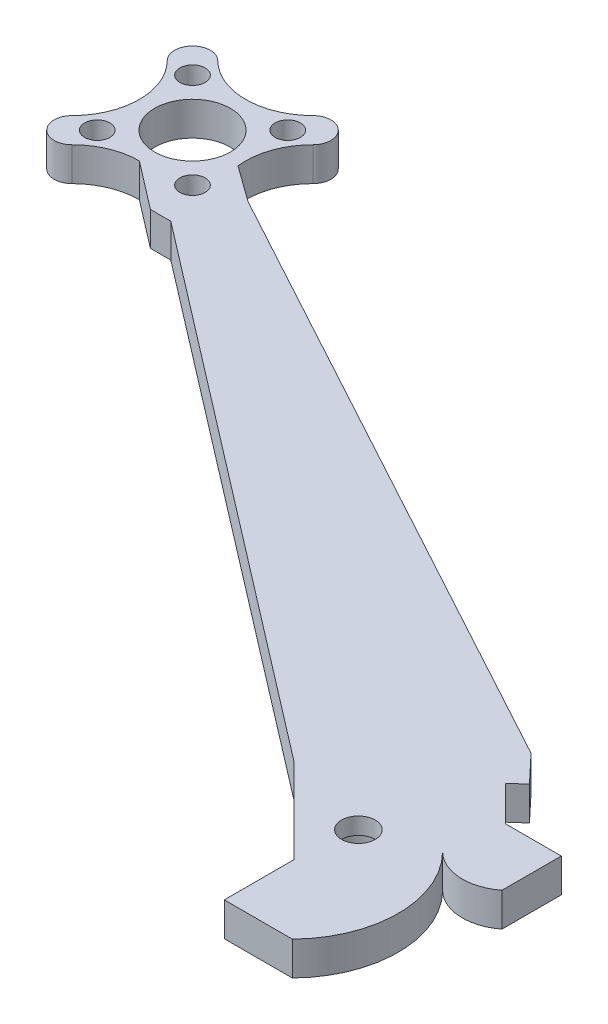
ISO-10303-21;
HEADER;
FILE_DESCRIPTION(('STEP AP214'),'2;1');
FILE_NAME('part.step','',(''),(''),'','','');
FILE_SCHEMA(('AUTOMOTIVE_DESIGN { 1 0 10303 214 1 1 1 1 }'));
ENDSEC;
DATA;
#1=APPLICATION_CONTEXT('core data for automotive mechanical design processes');
#2=APPLICATION_PROTOCOL_DEFINITION('international standard','automotive_design',2000,#1);
#3=PRODUCT_CONTEXT('',#1,'mechanical');
#4=PRODUCT('Part','Part','',(#3));
#5=PRODUCT_RELATED_PRODUCT_CATEGORY('part','',(#4));
#6=PRODUCT_DEFINITION_FORMATION('','',#4);
#7=PRODUCT_DEFINITION_CONTEXT('part definition',#1,'design');
#8=PRODUCT_DEFINITION('design','',#6,#7);
#9=PRODUCT_DEFINITION_SHAPE('','',#8);
#10=(LENGTH_UNIT() NAMED_UNIT(*) SI_UNIT(.MILLI.,.METRE.));
#11=(NAMED_UNIT(*) PLANE_ANGLE_UNIT() SI_UNIT($,.RADIAN.));
#12=(NAMED_UNIT(*) SI_UNIT($,.STERADIAN.) SOLID_ANGLE_UNIT());
#13=UNCERTAINTY_MEASURE_WITH_UNIT(LENGTH_MEASURE(1.E-05),#10,'distance_accuracy_value','');
#14=(GEOMETRIC_REPRESENTATION_CONTEXT(3) GLOBAL_UNCERTAINTY_ASSIGNED_CONTEXT((#13)) GLOBAL_UNIT_ASSIGNED_CONTEXT((#10,
#11,#12)) REPRESENTATION_CONTEXT('',''));
#15=CARTESIAN_POINT('',(0.,0.,0.));
#16=DIRECTION('',(0.,0.,1.));
#17=DIRECTION('',(1.,0.,0.));
#18=AXIS2_PLACEMENT_3D('',#15,#16,#17);
#19=CARTESIAN_POINT('',(81.80780567727,10.,62.1037977929157));
#20=DIRECTION('',(0.,-1.,0.));
#21=DIRECTION('',(0.,0.,-1.));
#22=AXIS2_PLACEMENT_3D('',#19,#20,#21);
#23=CYLINDRICAL_SURFACE('',#22,1.99999999999999);
#24=CARTESIAN_POINT('',(81.80780567727,4.,62.1037977929157));
#25=DIRECTION('',(0.,1.,0.));
#26=DIRECTION('',(0.,0.,1.));
#27=AXIS2_PLACEMENT_3D('',#24,#25,#26);
#28=CIRCLE('',#27,1.99999999999999);
#29=CARTESIAN_POINT('',(81.80780567727,4.,64.1037977929157));
#30=VERTEX_POINT('',#29);
#31=EDGE_CURVE('E223',#30,#30,#28,.T.);
#32=ORIENTED_EDGE('',*,*,#31,.T.);
#33=EDGE_LOOP('',(#32));
#34=FACE_BOUND('',#33,.T.);
#35=CARTESIAN_POINT('',(81.80780567727,2.,62.1037977929157));
#36=DIRECTION('',(0.,-1.,0.));
#37=DIRECTION('',(0.,0.,-1.));
#38=AXIS2_PLACEMENT_3D('',#35,#36,#37);
#39=CIRCLE('',#38,1.99999999999999);
#40=CARTESIAN_POINT('',(81.80780567727,2.,60.1037977929157));
#41=VERTEX_POINT('',#40);
#42=EDGE_CURVE('E51',#41,#41,#39,.F.);
#43=ORIENTED_EDGE('',*,*,#42,.F.);
#44=EDGE_LOOP('',(#43));
#45=FACE_BOUND('',#44,.T.);
#46=ADVANCED_FACE('F50',(#34,#45),#23,.F.);
#47=CARTESIAN_POINT('',(0.,4.,0.));
#48=DIRECTION('',(0.,1.,0.));
#49=DIRECTION('',(0.,0.,1.));
#50=AXIS2_PLACEMENT_3D('',#47,#48,#49);
#51=PLANE('',#50);
#52=ORIENTED_EDGE('',*,*,#31,.F.);
#53=EDGE_LOOP('',(#52));
#54=FACE_BOUND('',#53,.T.);
#55=CARTESIAN_POINT('',(-5.65685424949232,4.,-5.65685424949244));
#56=DIRECTION('',(0.,1.,0.));
#57=DIRECTION('',(0.,0.,1.));
#58=AXIS2_PLACEMENT_3D('',#55,#56,#57);
#59=CIRCLE('',#58,1.5);
#60=CARTESIAN_POINT('',(-5.65685424949232,4.,-4.15685424949244));
#61=VERTEX_POINT('',#60);
#62=EDGE_CURVE('E443',#61,#61,#59,.T.);
#63=ORIENTED_EDGE('',*,*,#62,.F.);
#64=EDGE_LOOP('',(#63));
#65=FACE_BOUND('',#64,.T.);
#66=CARTESIAN_POINT('',(-5.65685424949242,4.,5.65685424949234));
#67=DIRECTION('',(0.,1.,0.));
#68=DIRECTION('',(0.,0.,1.));
#69=AXIS2_PLACEMENT_3D('',#66,#67,#68);
#70=CIRCLE('',#69,1.5);
#71=CARTESIAN_POINT('',(-5.65685424949242,4.,7.15685424949234));
#72=VERTEX_POINT('',#71);
#73=EDGE_CURVE('E436',#72,#72,#70,.T.);
#74=ORIENTED_EDGE('',*,*,#73,.F.);
#75=EDGE_LOOP('',(#74));
#76=FACE_BOUND('',#75,.T.);
#77=CARTESIAN_POINT('',(5.65685424949238,4.,-5.65685424949238));
#78=DIRECTION('',(0.,1.,0.));
#79=DIRECTION('',(0.,0.,1.));
#80=AXIS2_PLACEMENT_3D('',#77,#78,#79);
#81=CIRCLE('',#80,1.5);
#82=CARTESIAN_POINT('',(5.65685424949238,4.,-4.15685424949238));
#83=VERTEX_POINT('',#82);
#84=EDGE_CURVE('E431',#83,#83,#81,.T.);
#85=ORIENTED_EDGE('',*,*,#84,.F.);
#86=EDGE_LOOP('',(#85));
#87=FACE_BOUND('',#86,.T.);
#88=CARTESIAN_POINT('',(0.,4.,0.));
#89=DIRECTION('',(0.,1.,0.));
#90=DIRECTION('',(0.,0.,1.));
#91=AXIS2_PLACEMENT_3D('',#88,#89,#90);
#92=CIRCLE('',#91,4.5);
#93=CARTESIAN_POINT('',(0.,4.,4.5));
#94=VERTEX_POINT('',#93);
#95=EDGE_CURVE('E459',#94,#94,#92,.T.);
#96=ORIENTED_EDGE('',*,*,#95,.F.);
#97=EDGE_LOOP('',(#96));
#98=FACE_BOUND('',#97,.T.);
#99=CARTESIAN_POINT('',(5.65685424949236,4.,5.6568542494924));
#100=DIRECTION('',(0.,1.,0.));
#101=DIRECTION('',(0.,0.,1.));
#102=AXIS2_PLACEMENT_3D('',#99,#100,#101);
#103=CIRCLE('',#102,1.5);
#104=CARTESIAN_POINT('',(5.65685424949236,4.,7.1568542494924));
#105=VERTEX_POINT('',#104);
#106=EDGE_CURVE('E430',#105,#105,#103,.T.);
#107=ORIENTED_EDGE('',*,*,#106,.F.);
#108=EDGE_LOOP('',(#107));
#109=FACE_BOUND('',#108,.T.);
#110=CARTESIAN_POINT('',(80.0614070112013,4.,68.3559558555536));
#111=DIRECTION('',(0.,-1.,0.));
#112=DIRECTION('',(0.,0.,-1.));
#113=AXIS2_PLACEMENT_3D('',#110,#111,#112);
#114=CIRCLE('',#113,12.7279220613578);
#115=CARTESIAN_POINT('',(89.0614070112014,4.,59.3559558555538));
#116=VERTEX_POINT('',#115);
#117=CARTESIAN_POINT('',(89.1342012001975,4.,77.2825680687124));
#118=VERTEX_POINT('',#117);
#119=EDGE_CURVE('E63',#116,#118,#114,.T.);
#120=ORIENTED_EDGE('',*,*,#119,.F.);
#121=CARTESIAN_POINT('',(93.0614070112013,4.,55.3559558555539));
#122=DIRECTION('',(0.,1.,0.));
#123=DIRECTION('',(0.,0.,1.));
#124=AXIS2_PLACEMENT_3D('',#121,#122,#123);
#125=CIRCLE('',#124,5.65685424949223);
#126=CARTESIAN_POINT('',(96.5614070112013,4.,59.8000530642115));
#127=VERTEX_POINT('',#126);
#128=EDGE_CURVE('E205',#116,#127,#125,.T.);
#129=ORIENTED_EDGE('',*,*,#128,.T.);
#130=DIRECTION('',(0.,0.,-1.));
#131=VECTOR('',#130,1.);
#132=CARTESIAN_POINT('',(96.5614070112013,4.,52.7610345676334));
#133=LINE('',#132,#131);
#134=CARTESIAN_POINT('',(96.5614070112013,4.,52.7610345676334));
#135=VERTEX_POINT('',#134);
#136=EDGE_CURVE('E331',#127,#135,#133,.T.);
#137=ORIENTED_EDGE('',*,*,#136,.T.);
#138=DIRECTION('',(1.,0.,0.));
#139=VECTOR('',#138,1.);
#140=CARTESIAN_POINT('',(90.5019503136648,4.,52.7610345676334));
#141=LINE('',#140,#139);
#142=CARTESIAN_POINT('',(89.9608894690823,4.,52.7610345676334));
#143=VERTEX_POINT('',#142);
#144=EDGE_CURVE('E358',#143,#135,#141,.T.);
#145=ORIENTED_EDGE('',*,*,#144,.F.);
#146=DIRECTION('',(0.707331619227857,0.,0.706881871630966));
#147=VECTOR('',#146,1.);
#148=CARTESIAN_POINT('',(85.7805147252344,4.,48.5833178606157));
#149=LINE('',#148,#147);
#150=CARTESIAN_POINT('',(85.7805147252344,4.,48.5833178606157));
#151=VERTEX_POINT('',#150);
#152=EDGE_CURVE('E370',#151,#143,#149,.T.);
#153=ORIENTED_EDGE('',*,*,#152,.F.);
#154=DIRECTION('',(-0.749062373849123,0.,0.66249947930811));
#155=VECTOR('',#154,1.);
#156=CARTESIAN_POINT('',(87.2786394729325,4.,47.2583189019996));
#157=LINE('',#156,#155);
#158=CARTESIAN_POINT('',(87.2786394729325,4.,47.2583189019996));
#159=VERTEX_POINT('',#158);
#160=EDGE_CURVE('E350',#159,#151,#157,.T.);
#161=ORIENTED_EDGE('',*,*,#160,.F.);
#162=DIRECTION('',(-0.685611663685296,0.,-0.727967476346767));
#163=VECTOR('',#162,1.);
#164=CARTESIAN_POINT('',(87.2786394729325,4.,47.2583189019996));
#165=LINE('',#164,#163);
#166=CARTESIAN_POINT('',(84.1934838147439,4.,43.9825680687124));
#167=VERTEX_POINT('',#166);
#168=EDGE_CURVE('E295',#159,#167,#165,.T.);
#169=ORIENTED_EDGE('',*,*,#168,.T.);
#170=DIRECTION('',(-0.878817112661968,0.,-0.477158760259604));
#171=VECTOR('',#170,1.);
#172=CARTESIAN_POINT('',(84.1934838147439,4.,43.9825680687124));
#173=LINE('',#172,#171);
#174=CARTESIAN_POINT('',(10.655,4.,4.05442913872873));
#175=VERTEX_POINT('',#174);
#176=EDGE_CURVE('E377',#167,#175,#173,.T.);
#177=ORIENTED_EDGE('',*,*,#176,.T.);
#178=DIRECTION('',(-0.811476008534574,0.,-0.584385735257797));
#179=VECTOR('',#178,1.);
#180=CARTESIAN_POINT('',(6.37280582790223,4.,0.970600210382307));
#181=LINE('',#180,#179);
#182=CARTESIAN_POINT('',(6.37280582790223,4.,0.970600210382307));
#183=VERTEX_POINT('',#182);
#184=EDGE_CURVE('E203',#175,#183,#181,.T.);
#185=ORIENTED_EDGE('',*,*,#184,.T.);
#186=CARTESIAN_POINT('',(14.3137084989848,4.,0.));
#187=DIRECTION('',(0.,-1.,0.));
#188=DIRECTION('',(0.,0.,1.));
#189=AXIS2_PLACEMENT_3D('',#186,#187,#188);
#190=CIRCLE('',#189,7.99999999999998);
#191=CARTESIAN_POINT('',(8.65685424949238,4.,-5.65685424949238));
#192=VERTEX_POINT('',#191);
#193=EDGE_CURVE('E296',#183,#192,#190,.T.);
#194=ORIENTED_EDGE('',*,*,#193,.T.);
#195=CARTESIAN_POINT('',(7.15685424949238,4.,-7.15685424949241));
#196=DIRECTION('',(0.,1.,0.));
#197=DIRECTION('',(0.,0.,-1.));
#198=AXIS2_PLACEMENT_3D('',#195,#196,#197);
#199=CIRCLE('',#198,2.12132034355966);
#200=CARTESIAN_POINT('',(5.65685424949238,4.,-8.65685424949244));
#201=VERTEX_POINT('',#200);
#202=EDGE_CURVE('E301',#192,#201,#199,.T.);
#203=ORIENTED_EDGE('',*,*,#202,.T.);
#204=CARTESIAN_POINT('',(0.,4.,-14.3137084989848));
#205=DIRECTION('',(0.,-1.,0.));
#206=DIRECTION('',(0.,0.,-1.));
#207=AXIS2_PLACEMENT_3D('',#204,#205,#206);
#208=CIRCLE('',#207,7.99999999999996);
#209=CARTESIAN_POINT('',(-5.65685424949232,4.,-8.65685424949244));
#210=VERTEX_POINT('',#209);
#211=EDGE_CURVE('E254',#201,#210,#208,.T.);
#212=ORIENTED_EDGE('',*,*,#211,.T.);
#213=CARTESIAN_POINT('',(-7.15685424949232,4.,-7.15685424949244));
#214=DIRECTION('',(0.,1.,0.));
#215=DIRECTION('',(0.,0.,-1.));
#216=AXIS2_PLACEMENT_3D('',#213,#214,#215);
#217=CIRCLE('',#216,2.12132034355964);
#218=CARTESIAN_POINT('',(-8.65685424949232,4.,-5.65685424949244));
#219=VERTEX_POINT('',#218);
#220=EDGE_CURVE('E246',#210,#219,#217,.T.);
#221=ORIENTED_EDGE('',*,*,#220,.T.);
#222=CARTESIAN_POINT('',(-14.3137084989847,4.,0.));
#223=DIRECTION('',(0.,-1.,0.));
#224=DIRECTION('',(0.,0.,-1.));
#225=AXIS2_PLACEMENT_3D('',#222,#223,#224);
#226=CIRCLE('',#225,8.00000000000002);
#227=CARTESIAN_POINT('',(-8.65685424949232,4.,5.65685424949234));
#228=VERTEX_POINT('',#227);
#229=EDGE_CURVE('E285',#219,#228,#226,.T.);
#230=ORIENTED_EDGE('',*,*,#229,.T.);
#231=CARTESIAN_POINT('',(-7.15685424949237,4.,7.15685424949234));
#232=DIRECTION('',(0.,1.,0.));
#233=DIRECTION('',(0.,0.,1.));
#234=AXIS2_PLACEMENT_3D('',#231,#232,#233);
#235=CIRCLE('',#234,2.12132034355961);
#236=CARTESIAN_POINT('',(-5.65685424949242,4.,8.65685424949234));
#237=VERTEX_POINT('',#236);
#238=EDGE_CURVE('E287',#228,#237,#235,.T.);
#239=ORIENTED_EDGE('',*,*,#238,.T.);
#240=CARTESIAN_POINT('',(0.,4.,14.3137084989848));
#241=DIRECTION('',(0.,-1.,0.));
#242=DIRECTION('',(0.,0.,-1.));
#243=AXIS2_PLACEMENT_3D('',#240,#241,#242);
#244=CIRCLE('',#243,8.00000000000003);
#245=CARTESIAN_POINT('',(0.,4.,6.31370849898472));
#246=VERTEX_POINT('',#245);
#247=EDGE_CURVE('E288',#237,#246,#244,.T.);
#248=ORIENTED_EDGE('',*,*,#247,.T.);
#249=DIRECTION('',(0.793310358918495,0.,0.608817439330222));
#250=VECTOR('',#249,1.);
#251=CARTESIAN_POINT('',(5.65685424949236,4.,10.655));
#252=LINE('',#251,#250);
#253=CARTESIAN_POINT('',(5.65685424949236,4.,10.655));
#254=VERTEX_POINT('',#253);
#255=EDGE_CURVE('E231',#246,#254,#252,.T.);
#256=ORIENTED_EDGE('',*,*,#255,.T.);
#257=DIRECTION('',(1.,0.,0.));
#258=VECTOR('',#257,1.);
#259=CARTESIAN_POINT('',(0.,4.,10.655));
#260=LINE('',#259,#258);
#261=CARTESIAN_POINT('',(8.07969409634453,4.,10.655));
#262=VERTEX_POINT('',#261);
#263=EDGE_CURVE('E414',#254,#262,#260,.T.);
#264=ORIENTED_EDGE('',*,*,#263,.T.);
#265=DIRECTION('',(0.793353340291236,0.,0.60876142900872));
#266=VECTOR('',#265,1.);
#267=CARTESIAN_POINT('',(71.0614070112013,4.,58.9825680687125));
#268=LINE('',#267,#266);
#269=CARTESIAN_POINT('',(71.0614070112013,4.,58.9825680687125));
#270=VERTEX_POINT('',#269);
#271=EDGE_CURVE('E405',#262,#270,#268,.T.);
#272=ORIENTED_EDGE('',*,*,#271,.T.);
#273=DIRECTION('',(0.707106781186547,0.,0.707106781186548));
#274=VECTOR('',#273,1.);
#275=CARTESIAN_POINT('',(71.0614070112013,4.,58.9825680687125));
#276=LINE('',#275,#274);
#277=CARTESIAN_POINT('',(81.0614070112013,4.,68.9825680687125));
#278=VERTEX_POINT('',#277);
#279=EDGE_CURVE('E403',#270,#278,#276,.T.);
#280=ORIENTED_EDGE('',*,*,#279,.T.);
#281=DIRECTION('',(0.,0.,1.));
#282=VECTOR('',#281,1.);
#283=CARTESIAN_POINT('',(81.0614070112013,4.,68.9825680687125));
#284=LINE('',#283,#282);
#285=CARTESIAN_POINT('',(81.0614070112013,4.,77.2825680687124));
#286=VERTEX_POINT('',#285);
#287=EDGE_CURVE('E390',#278,#286,#284,.T.);
#288=ORIENTED_EDGE('',*,*,#287,.T.);
#289=DIRECTION('',(1.,0.,0.));
#290=VECTOR('',#289,1.);
#291=CARTESIAN_POINT('',(81.0614070112013,4.,77.2825680687124));
#292=LINE('',#291,#290);
#293=EDGE_CURVE('E311',#286,#118,#292,.T.);
#294=ORIENTED_EDGE('',*,*,#293,.T.);
#295=EDGE_LOOP('',(#120,#129,#137,#145,#153,#161,#169,#177,#185,#194,#203,#212,#221,#230,#239,
#248,#256,#264,#272,#280,#288,#294));
#296=FACE_BOUND('',#295,.T.);
#297=ADVANCED_FACE('F481',(#54,#65,#76,#87,#98,#109,#296),#51,.T.);
#298=CARTESIAN_POINT('',(96.5614070112013,0.,52.7610345676334));
#299=DIRECTION('',(1.,0.,0.));
#300=DIRECTION('',(0.,0.,-1.));
#301=AXIS2_PLACEMENT_3D('',#298,#299,#300);
#302=PLANE('',#301);
#303=ORIENTED_EDGE('',*,*,#136,.F.);
#304=DIRECTION('',(0.,1.,0.));
#305=VECTOR('',#304,1.);
#306=CARTESIAN_POINT('',(96.5614070112013,0.,59.8000530642115));
#307=LINE('',#306,#305);
#308=CARTESIAN_POINT('',(96.5614070112013,0.,59.8000530642115));
#309=VERTEX_POINT('',#308);
#310=EDGE_CURVE('E12',#127,#309,#307,.F.);
#311=ORIENTED_EDGE('',*,*,#310,.T.);
#312=DIRECTION('',(0.,0.,-1.));
#313=VECTOR('',#312,1.);
#314=CARTESIAN_POINT('',(96.5614070112013,0.,52.7610345676334));
#315=LINE('',#314,#313);
#316=CARTESIAN_POINT('',(96.5614070112013,0.,52.7610345676334));
#317=VERTEX_POINT('',#316);
#318=EDGE_CURVE('E216',#309,#317,#315,.T.);
#319=ORIENTED_EDGE('',*,*,#318,.T.);
#320=DIRECTION('',(0.,1.,0.));
#321=VECTOR('',#320,1.);
#322=CARTESIAN_POINT('',(96.5614070112013,0.,52.7610345676334));
#323=LINE('',#322,#321);
#324=EDGE_CURVE('E345',#317,#135,#323,.T.);
#325=ORIENTED_EDGE('',*,*,#324,.T.);
#326=EDGE_LOOP('',(#303,#311,#319,#325));
#327=FACE_BOUND('',#326,.T.);
#328=ADVANCED_FACE('F544',(#327),#302,.T.);
#329=CARTESIAN_POINT('',(0.,0.,0.));
#330=DIRECTION('',(0.,1.,0.));
#331=DIRECTION('',(0.,0.,1.));
#332=AXIS2_PLACEMENT_3D('',#329,#330,#331);
#333=PLANE('',#332);
#334=CARTESIAN_POINT('',(81.80780567727,0.,62.1037977929157));
#335=DIRECTION('',(0.,-1.,0.));
#336=DIRECTION('',(0.,0.,-1.));
#337=AXIS2_PLACEMENT_3D('',#334,#335,#336);
#338=CIRCLE('',#337,3.00000000000001);
#339=CARTESIAN_POINT('',(81.80780567727,0.,59.1037977929157));
#340=VERTEX_POINT('',#339);
#341=EDGE_CURVE('E657',#340,#340,#338,.T.);
#342=ORIENTED_EDGE('',*,*,#341,.F.);
#343=EDGE_LOOP('',(#342));
#344=FACE_BOUND('',#343,.T.);
#345=CARTESIAN_POINT('',(93.0614070112013,0.,55.3559558555539));
#346=DIRECTION('',(0.,1.,0.));
#347=DIRECTION('',(0.,0.,1.));
#348=AXIS2_PLACEMENT_3D('',#345,#346,#347);
#349=CIRCLE('',#348,5.65685424949223);
#350=CARTESIAN_POINT('',(89.0614070112014,0.,59.3559558555538));
#351=VERTEX_POINT('',#350);
#352=EDGE_CURVE('E202',#351,#309,#349,.T.);
#353=ORIENTED_EDGE('',*,*,#352,.F.);
#354=CARTESIAN_POINT('',(80.0614070112013,0.,68.3559558555536));
#355=DIRECTION('',(0.,-1.,0.));
#356=DIRECTION('',(0.,0.,-1.));
#357=AXIS2_PLACEMENT_3D('',#354,#355,#356);
#358=CIRCLE('',#357,12.7279220613578);
#359=CARTESIAN_POINT('',(89.1342012001975,0.,77.2825680687124));
#360=VERTEX_POINT('',#359);
#361=EDGE_CURVE('E206',#351,#360,#358,.T.);
#362=ORIENTED_EDGE('',*,*,#361,.T.);
#363=DIRECTION('',(1.,0.,0.));
#364=VECTOR('',#363,1.);
#365=CARTESIAN_POINT('',(81.0614070112013,0.,77.2825680687124));
#366=LINE('',#365,#364);
#367=CARTESIAN_POINT('',(81.0614070112013,0.,77.2825680687124));
#368=VERTEX_POINT('',#367);
#369=EDGE_CURVE('E332',#368,#360,#366,.T.);
#370=ORIENTED_EDGE('',*,*,#369,.F.);
#371=DIRECTION('',(0.,0.,1.));
#372=VECTOR('',#371,1.);
#373=CARTESIAN_POINT('',(81.0614070112013,0.,68.9825680687125));
#374=LINE('',#373,#372);
#375=CARTESIAN_POINT('',(81.0614070112013,0.,68.9825680687125));
#376=VERTEX_POINT('',#375);
#377=EDGE_CURVE('E392',#376,#368,#374,.T.);
#378=ORIENTED_EDGE('',*,*,#377,.F.);
#379=DIRECTION('',(0.707106781186547,0.,0.707106781186548));
#380=VECTOR('',#379,1.);
#381=CARTESIAN_POINT('',(71.0614070112013,0.,58.9825680687125));
#382=LINE('',#381,#380);
#383=CARTESIAN_POINT('',(71.0614070112013,0.,58.9825680687125));
#384=VERTEX_POINT('',#383);
#385=EDGE_CURVE('E393',#384,#376,#382,.T.);
#386=ORIENTED_EDGE('',*,*,#385,.F.);
#387=DIRECTION('',(0.793353340291236,0.,0.60876142900872));
#388=VECTOR('',#387,1.);
#389=CARTESIAN_POINT('',(71.0614070112013,0.,58.9825680687125));
#390=LINE('',#389,#388);
#391=CARTESIAN_POINT('',(8.07969409634453,0.,10.655));
#392=VERTEX_POINT('',#391);
#393=EDGE_CURVE('E386',#392,#384,#390,.T.);
#394=ORIENTED_EDGE('',*,*,#393,.F.);
#395=DIRECTION('',(1.,0.,0.));
#396=VECTOR('',#395,1.);
#397=CARTESIAN_POINT('',(0.,0.,10.655));
#398=LINE('',#397,#396);
#399=CARTESIAN_POINT('',(5.65685424949236,0.,10.655));
#400=VERTEX_POINT('',#399);
#401=EDGE_CURVE('E423',#400,#392,#398,.T.);
#402=ORIENTED_EDGE('',*,*,#401,.F.);
#403=DIRECTION('',(0.793310358918495,0.,0.608817439330222));
#404=VECTOR('',#403,1.);
#405=CARTESIAN_POINT('',(5.65685424949236,0.,10.655));
#406=LINE('',#405,#404);
#407=CARTESIAN_POINT('',(0.,0.,6.31370849898472));
#408=VERTEX_POINT('',#407);
#409=EDGE_CURVE('E235',#408,#400,#406,.T.);
#410=ORIENTED_EDGE('',*,*,#409,.F.);
#411=CARTESIAN_POINT('',(0.,0.,14.3137084989848));
#412=DIRECTION('',(0.,-1.,0.));
#413=DIRECTION('',(0.,0.,-1.));
#414=AXIS2_PLACEMENT_3D('',#411,#412,#413);
#415=CIRCLE('',#414,8.00000000000003);
#416=CARTESIAN_POINT('',(-5.65685424949242,0.,8.65685424949234));
#417=VERTEX_POINT('',#416);
#418=EDGE_CURVE('E263',#417,#408,#415,.T.);
#419=ORIENTED_EDGE('',*,*,#418,.F.);
#420=CARTESIAN_POINT('',(-7.15685424949237,0.,7.15685424949234));
#421=DIRECTION('',(0.,1.,0.));
#422=DIRECTION('',(0.,0.,1.));
#423=AXIS2_PLACEMENT_3D('',#420,#421,#422);
#424=CIRCLE('',#423,2.12132034355961);
#425=CARTESIAN_POINT('',(-8.65685424949232,0.,5.65685424949234));
#426=VERTEX_POINT('',#425);
#427=EDGE_CURVE('E256',#426,#417,#424,.T.);
#428=ORIENTED_EDGE('',*,*,#427,.F.);
#429=CARTESIAN_POINT('',(-14.3137084989847,0.,0.));
#430=DIRECTION('',(0.,-1.,0.));
#431=DIRECTION('',(0.,0.,-1.));
#432=AXIS2_PLACEMENT_3D('',#429,#430,#431);
#433=CIRCLE('',#432,8.00000000000002);
#434=CARTESIAN_POINT('',(-8.65685424949232,0.,-5.65685424949244));
#435=VERTEX_POINT('',#434);
#436=EDGE_CURVE('E255',#435,#426,#433,.T.);
#437=ORIENTED_EDGE('',*,*,#436,.F.);
#438=CARTESIAN_POINT('',(-7.15685424949232,0.,-7.15685424949244));
#439=DIRECTION('',(0.,1.,0.));
#440=DIRECTION('',(0.,0.,-1.));
#441=AXIS2_PLACEMENT_3D('',#438,#439,#440);
#442=CIRCLE('',#441,2.12132034355964);
#443=CARTESIAN_POINT('',(-5.65685424949232,0.,-8.65685424949244));
#444=VERTEX_POINT('',#443);
#445=EDGE_CURVE('E248',#444,#435,#442,.T.);
#446=ORIENTED_EDGE('',*,*,#445,.F.);
#447=CARTESIAN_POINT('',(0.,0.,-14.3137084989848));
#448=DIRECTION('',(0.,-1.,0.));
#449=DIRECTION('',(0.,0.,-1.));
#450=AXIS2_PLACEMENT_3D('',#447,#448,#449);
#451=CIRCLE('',#450,7.99999999999996);
#452=CARTESIAN_POINT('',(5.65685424949238,0.,-8.65685424949244));
#453=VERTEX_POINT('',#452);
#454=EDGE_CURVE('E274',#453,#444,#451,.T.);
#455=ORIENTED_EDGE('',*,*,#454,.F.);
#456=CARTESIAN_POINT('',(7.15685424949238,0.,-7.15685424949241));
#457=DIRECTION('',(0.,1.,0.));
#458=DIRECTION('',(0.,0.,-1.));
#459=AXIS2_PLACEMENT_3D('',#456,#457,#458);
#460=CIRCLE('',#459,2.12132034355966);
#461=CARTESIAN_POINT('',(8.65685424949238,0.,-5.65685424949238));
#462=VERTEX_POINT('',#461);
#463=EDGE_CURVE('E268',#462,#453,#460,.T.);
#464=ORIENTED_EDGE('',*,*,#463,.F.);
#465=CARTESIAN_POINT('',(14.3137084989848,0.,0.));
#466=DIRECTION('',(0.,-1.,0.));
#467=DIRECTION('',(0.,0.,1.));
#468=AXIS2_PLACEMENT_3D('',#465,#466,#467);
#469=CIRCLE('',#468,7.99999999999998);
#470=CARTESIAN_POINT('',(6.37280582790223,0.,0.970600210382307));
#471=VERTEX_POINT('',#470);
#472=EDGE_CURVE('E269',#471,#462,#469,.T.);
#473=ORIENTED_EDGE('',*,*,#472,.F.);
#474=DIRECTION('',(-0.811476008534574,0.,-0.584385735257797));
#475=VECTOR('',#474,1.);
#476=CARTESIAN_POINT('',(6.37280582790223,0.,0.970600210382307));
#477=LINE('',#476,#475);
#478=CARTESIAN_POINT('',(10.655,0.,4.05442913872873));
#479=VERTEX_POINT('',#478);
#480=EDGE_CURVE('E226',#479,#471,#477,.T.);
#481=ORIENTED_EDGE('',*,*,#480,.F.);
#482=DIRECTION('',(-0.878817112661968,0.,-0.477158760259604));
#483=VECTOR('',#482,1.);
#484=CARTESIAN_POINT('',(84.1934838147439,0.,43.9825680687124));
#485=LINE('',#484,#483);
#486=CARTESIAN_POINT('',(84.1934838147439,0.,43.9825680687124));
#487=VERTEX_POINT('',#486);
#488=EDGE_CURVE('E381',#487,#479,#485,.T.);
#489=ORIENTED_EDGE('',*,*,#488,.F.);
#490=DIRECTION('',(-0.685611663685296,0.,-0.727967476346767));
#491=VECTOR('',#490,1.);
#492=CARTESIAN_POINT('',(87.2786394729325,0.,47.2583189019996));
#493=LINE('',#492,#491);
#494=CARTESIAN_POINT('',(87.2786394729325,0.,47.2583189019996));
#495=VERTEX_POINT('',#494);
#496=EDGE_CURVE('E264',#495,#487,#493,.T.);
#497=ORIENTED_EDGE('',*,*,#496,.F.);
#498=DIRECTION('',(-0.749062373849123,0.,0.66249947930811));
#499=VECTOR('',#498,1.);
#500=CARTESIAN_POINT('',(87.2786394729325,0.,47.2583189019996));
#501=LINE('',#500,#499);
#502=CARTESIAN_POINT('',(85.7805147252344,0.,48.5833178606157));
#503=VERTEX_POINT('',#502);
#504=EDGE_CURVE('E352',#495,#503,#501,.T.);
#505=ORIENTED_EDGE('',*,*,#504,.T.);
#506=DIRECTION('',(0.707331619227857,0.,0.706881871630966));
#507=VECTOR('',#506,1.);
#508=CARTESIAN_POINT('',(85.7805147252344,0.,48.5833178606157));
#509=LINE('',#508,#507);
#510=CARTESIAN_POINT('',(89.9608894690823,0.,52.7610345676334));
#511=VERTEX_POINT('',#510);
#512=EDGE_CURVE('E353',#503,#511,#509,.T.);
#513=ORIENTED_EDGE('',*,*,#512,.T.);
#514=DIRECTION('',(1.,0.,0.));
#515=VECTOR('',#514,1.);
#516=CARTESIAN_POINT('',(89.9608894690823,0.,52.7610345676334));
#517=LINE('',#516,#515);
#518=EDGE_CURVE('E359',#511,#317,#517,.T.);
#519=ORIENTED_EDGE('',*,*,#518,.T.);
#520=ORIENTED_EDGE('',*,*,#318,.F.);
#521=EDGE_LOOP('',(#353,#362,#370,#378,#386,#394,#402,#410,#419,#428,#437,#446,#455,#464,#473,
#481,#489,#497,#505,#513,#519,#520));
#522=FACE_BOUND('',#521,.T.);
#523=CARTESIAN_POINT('',(-5.65685424949232,0.,-5.65685424949244));
#524=DIRECTION('',(0.,1.,0.));
#525=DIRECTION('',(0.,0.,1.));
#526=AXIS2_PLACEMENT_3D('',#523,#524,#525);
#527=CIRCLE('',#526,1.5);
#528=CARTESIAN_POINT('',(-5.65685424949232,0.,-4.15685424949244));
#529=VERTEX_POINT('',#528);
#530=EDGE_CURVE('E425',#529,#529,#527,.T.);
#531=ORIENTED_EDGE('',*,*,#530,.T.);
#532=EDGE_LOOP('',(#531));
#533=FACE_BOUND('',#532,.T.);
#534=CARTESIAN_POINT('',(-5.65685424949242,0.,5.65685424949234));
#535=DIRECTION('',(0.,1.,0.));
#536=DIRECTION('',(0.,0.,1.));
#537=AXIS2_PLACEMENT_3D('',#534,#535,#536);
#538=CIRCLE('',#537,1.5);
#539=CARTESIAN_POINT('',(-5.65685424949242,0.,7.15685424949234));
#540=VERTEX_POINT('',#539);
#541=EDGE_CURVE('E439',#540,#540,#538,.T.);
#542=ORIENTED_EDGE('',*,*,#541,.T.);
#543=EDGE_LOOP('',(#542));
#544=FACE_BOUND('',#543,.T.);
#545=CARTESIAN_POINT('',(5.65685424949238,0.,-5.65685424949238));
#546=DIRECTION('',(0.,1.,0.));
#547=DIRECTION('',(0.,0.,1.));
#548=AXIS2_PLACEMENT_3D('',#545,#546,#547);
#549=CIRCLE('',#548,1.5);
#550=CARTESIAN_POINT('',(5.65685424949238,0.,-4.15685424949238));
#551=VERTEX_POINT('',#550);
#552=EDGE_CURVE('E454',#551,#551,#549,.T.);
#553=ORIENTED_EDGE('',*,*,#552,.T.);
#554=EDGE_LOOP('',(#553));
#555=FACE_BOUND('',#554,.T.);
#556=CARTESIAN_POINT('',(0.,0.,0.));
#557=DIRECTION('',(0.,1.,0.));
#558=DIRECTION('',(0.,0.,1.));
#559=AXIS2_PLACEMENT_3D('',#556,#557,#558);
#560=CIRCLE('',#559,4.5);
#561=CARTESIAN_POINT('',(0.,0.,4.5));
#562=VERTEX_POINT('',#561);
#563=EDGE_CURVE('E452',#562,#562,#560,.T.);
#564=ORIENTED_EDGE('',*,*,#563,.T.);
#565=EDGE_LOOP('',(#564));
#566=FACE_BOUND('',#565,.T.);
#567=CARTESIAN_POINT('',(5.65685424949236,0.,5.6568542494924));
#568=DIRECTION('',(0.,1.,0.));
#569=DIRECTION('',(0.,0.,1.));
#570=AXIS2_PLACEMENT_3D('',#567,#568,#569);
#571=CIRCLE('',#570,1.5);
#572=CARTESIAN_POINT('',(5.65685424949236,0.,7.1568542494924));
#573=VERTEX_POINT('',#572);
#574=EDGE_CURVE('E435',#573,#573,#571,.T.);
#575=ORIENTED_EDGE('',*,*,#574,.T.);
#576=EDGE_LOOP('',(#575));
#577=FACE_BOUND('',#576,.T.);
#578=ADVANCED_FACE('F47',(#344,#522,#533,#544,#555,#566,#577),#333,.F.);
#579=CARTESIAN_POINT('',(0.,4.,0.));
#580=DIRECTION('',(0.,-1.,0.));
#581=DIRECTION('',(0.,0.,-1.));
#582=AXIS2_PLACEMENT_3D('',#579,#580,#581);
#583=CYLINDRICAL_SURFACE('',#582,4.5);
#584=ORIENTED_EDGE('',*,*,#95,.T.);
#585=EDGE_LOOP('',(#584));
#586=FACE_BOUND('',#585,.T.);
#587=ORIENTED_EDGE('',*,*,#563,.F.);
#588=EDGE_LOOP('',(#587));
#589=FACE_BOUND('',#588,.T.);
#590=ADVANCED_FACE('F632',(#586,#589),#583,.F.);
#591=CARTESIAN_POINT('',(5.65685424949238,0.,-5.65685424949238));
#592=DIRECTION('',(0.,1.,0.));
#593=DIRECTION('',(0.,0.,1.));
#594=AXIS2_PLACEMENT_3D('',#591,#592,#593);
#595=CYLINDRICAL_SURFACE('',#594,1.5);
#596=ORIENTED_EDGE('',*,*,#552,.F.);
#597=EDGE_LOOP('',(#596));
#598=FACE_BOUND('',#597,.T.);
#599=ORIENTED_EDGE('',*,*,#84,.T.);
#600=EDGE_LOOP('',(#599));
#601=FACE_BOUND('',#600,.T.);
#602=ADVANCED_FACE('F624',(#598,#601),#595,.F.);
#603=CARTESIAN_POINT('',(5.65685424949236,0.,5.6568542494924));
#604=DIRECTION('',(0.,1.,0.));
#605=DIRECTION('',(0.,0.,1.));
#606=AXIS2_PLACEMENT_3D('',#603,#604,#605);
#607=CYLINDRICAL_SURFACE('',#606,1.5);
#608=ORIENTED_EDGE('',*,*,#574,.F.);
#609=EDGE_LOOP('',(#608));
#610=FACE_BOUND('',#609,.T.);
#611=ORIENTED_EDGE('',*,*,#106,.T.);
#612=EDGE_LOOP('',(#611));
#613=FACE_BOUND('',#612,.T.);
#614=ADVANCED_FACE('F619',(#610,#613),#607,.F.);
#615=CARTESIAN_POINT('',(-5.65685424949242,0.,5.65685424949234));
#616=DIRECTION('',(0.,1.,0.));
#617=DIRECTION('',(0.,0.,1.));
#618=AXIS2_PLACEMENT_3D('',#615,#616,#617);
#619=CYLINDRICAL_SURFACE('',#618,1.5);
#620=ORIENTED_EDGE('',*,*,#541,.F.);
#621=EDGE_LOOP('',(#620));
#622=FACE_BOUND('',#621,.T.);
#623=ORIENTED_EDGE('',*,*,#73,.T.);
#624=EDGE_LOOP('',(#623));
#625=FACE_BOUND('',#624,.T.);
#626=ADVANCED_FACE('F621',(#622,#625),#619,.F.);
#627=CARTESIAN_POINT('',(-5.65685424949232,0.,-5.65685424949244));
#628=DIRECTION('',(0.,1.,0.));
#629=DIRECTION('',(0.,0.,1.));
#630=AXIS2_PLACEMENT_3D('',#627,#628,#629);
#631=CYLINDRICAL_SURFACE('',#630,1.5);
#632=ORIENTED_EDGE('',*,*,#530,.F.);
#633=EDGE_LOOP('',(#632));
#634=FACE_BOUND('',#633,.T.);
#635=ORIENTED_EDGE('',*,*,#62,.T.);
#636=EDGE_LOOP('',(#635));
#637=FACE_BOUND('',#636,.T.);
#638=ADVANCED_FACE('F620',(#634,#637),#631,.F.);
#639=CARTESIAN_POINT('',(0.,0.,10.655));
#640=DIRECTION('',(0.,0.,1.));
#641=DIRECTION('',(1.,0.,0.));
#642=AXIS2_PLACEMENT_3D('',#639,#640,#641);
#643=PLANE('',#642);
#644=DIRECTION('',(0.,1.,0.));
#645=VECTOR('',#644,1.);
#646=CARTESIAN_POINT('',(5.65685424949236,0.,10.655));
#647=LINE('',#646,#645);
#648=EDGE_CURVE('E316',#400,#254,#647,.T.);
#649=ORIENTED_EDGE('',*,*,#648,.F.);
#650=ORIENTED_EDGE('',*,*,#401,.T.);
#651=DIRECTION('',(0.,-1.,0.));
#652=VECTOR('',#651,1.);
#653=CARTESIAN_POINT('',(8.07969409634454,0.,10.655));
#654=LINE('',#653,#652);
#655=EDGE_CURVE('E465',#262,#392,#654,.T.);
#656=ORIENTED_EDGE('',*,*,#655,.F.);
#657=ORIENTED_EDGE('',*,*,#263,.F.);
#658=EDGE_LOOP('',(#649,#650,#656,#657));
#659=FACE_BOUND('',#658,.T.);
#660=ADVANCED_FACE('F522',(#659),#643,.T.);
#661=CARTESIAN_POINT('',(81.0614070112013,0.,68.9825680687125));
#662=DIRECTION('',(-1.,0.,0.));
#663=DIRECTION('',(0.,0.,1.));
#664=AXIS2_PLACEMENT_3D('',#661,#662,#663);
#665=PLANE('',#664);
#666=ORIENTED_EDGE('',*,*,#287,.F.);
#667=DIRECTION('',(0.,1.,0.));
#668=VECTOR('',#667,1.);
#669=CARTESIAN_POINT('',(81.0614070112013,0.,68.9825680687125));
#670=LINE('',#669,#668);
#671=EDGE_CURVE('E413',#376,#278,#670,.T.);
#672=ORIENTED_EDGE('',*,*,#671,.F.);
#673=ORIENTED_EDGE('',*,*,#377,.T.);
#674=DIRECTION('',(0.,1.,0.));
#675=VECTOR('',#674,1.);
#676=CARTESIAN_POINT('',(81.0614070112013,0.,77.2825680687124));
#677=LINE('',#676,#675);
#678=EDGE_CURVE('E340',#368,#286,#677,.T.);
#679=ORIENTED_EDGE('',*,*,#678,.T.);
#680=EDGE_LOOP('',(#666,#672,#673,#679));
#681=FACE_BOUND('',#680,.T.);
#682=ADVANCED_FACE('F539',(#681),#665,.T.);
#683=CARTESIAN_POINT('',(71.0614070112013,0.,58.9825680687125));
#684=DIRECTION('',(-0.707106781186548,0.,0.707106781186547));
#685=DIRECTION('',(0.707106781186547,0.,0.707106781186548));
#686=AXIS2_PLACEMENT_3D('',#683,#684,#685);
#687=PLANE('',#686);
#688=ORIENTED_EDGE('',*,*,#279,.F.);
#689=DIRECTION('',(0.,1.,0.));
#690=VECTOR('',#689,1.);
#691=CARTESIAN_POINT('',(71.0614070112013,0.,58.9825680687125));
#692=LINE('',#691,#690);
#693=EDGE_CURVE('E412',#384,#270,#692,.T.);
#694=ORIENTED_EDGE('',*,*,#693,.F.);
#695=ORIENTED_EDGE('',*,*,#385,.T.);
#696=ORIENTED_EDGE('',*,*,#671,.T.);
#697=EDGE_LOOP('',(#688,#694,#695,#696));
#698=FACE_BOUND('',#697,.T.);
#699=ADVANCED_FACE('F531',(#698),#687,.T.);
#700=CARTESIAN_POINT('',(71.0614070112013,0.,58.9825680687125));
#701=DIRECTION('',(-0.60876142900872,0.,0.793353340291236));
#702=DIRECTION('',(0.793353340291236,0.,0.60876142900872));
#703=AXIS2_PLACEMENT_3D('',#700,#701,#702);
#704=PLANE('',#703);
#705=ORIENTED_EDGE('',*,*,#271,.F.);
#706=ORIENTED_EDGE('',*,*,#655,.T.);
#707=ORIENTED_EDGE('',*,*,#393,.T.);
#708=ORIENTED_EDGE('',*,*,#693,.T.);
#709=EDGE_LOOP('',(#705,#706,#707,#708));
#710=FACE_BOUND('',#709,.T.);
#711=ADVANCED_FACE('F530',(#710),#704,.T.);
#712=CARTESIAN_POINT('',(84.1934838147439,0.,43.9825680687124));
#713=DIRECTION('',(0.477158760259604,0.,-0.878817112661968));
#714=DIRECTION('',(-0.878817112661968,0.,-0.477158760259604));
#715=AXIS2_PLACEMENT_3D('',#712,#713,#714);
#716=PLANE('',#715);
#717=ORIENTED_EDGE('',*,*,#488,.T.);
#718=DIRECTION('',(0.,1.,0.));
#719=VECTOR('',#718,1.);
#720=CARTESIAN_POINT('',(10.655,0.,4.05442913872873));
#721=LINE('',#720,#719);
#722=EDGE_CURVE('E468',#479,#175,#721,.T.);
#723=ORIENTED_EDGE('',*,*,#722,.T.);
#724=ORIENTED_EDGE('',*,*,#176,.F.);
#725=DIRECTION('',(0.,1.,0.));
#726=VECTOR('',#725,1.);
#727=CARTESIAN_POINT('',(84.1934838147439,0.,43.9825680687124));
#728=LINE('',#727,#726);
#729=EDGE_CURVE('E400',#487,#167,#728,.T.);
#730=ORIENTED_EDGE('',*,*,#729,.F.);
#731=EDGE_LOOP('',(#717,#723,#724,#730));
#732=FACE_BOUND('',#731,.T.);
#733=ADVANCED_FACE('F480',(#732),#716,.T.);
#734=CARTESIAN_POINT('',(87.2786394729325,0.,47.2583189019996));
#735=DIRECTION('',(-0.66249947930811,0.,-0.749062373849123));
#736=DIRECTION('',(-0.749062373849123,0.,0.66249947930811));
#737=AXIS2_PLACEMENT_3D('',#734,#735,#736);
#738=PLANE('',#737);
#739=ORIENTED_EDGE('',*,*,#160,.T.);
#740=DIRECTION('',(0.,1.,0.));
#741=VECTOR('',#740,1.);
#742=CARTESIAN_POINT('',(85.7805147252344,0.,48.5833178606157));
#743=LINE('',#742,#741);
#744=EDGE_CURVE('E361',#503,#151,#743,.T.);
#745=ORIENTED_EDGE('',*,*,#744,.F.);
#746=ORIENTED_EDGE('',*,*,#504,.F.);
#747=DIRECTION('',(0.,1.,0.));
#748=VECTOR('',#747,1.);
#749=CARTESIAN_POINT('',(87.2786394729325,0.,47.2583189019996));
#750=LINE('',#749,#748);
#751=EDGE_CURVE('E372',#495,#159,#750,.T.);
#752=ORIENTED_EDGE('',*,*,#751,.T.);
#753=EDGE_LOOP('',(#739,#745,#746,#752));
#754=FACE_BOUND('',#753,.T.);
#755=ADVANCED_FACE('F554',(#754),#738,.F.);
#756=CARTESIAN_POINT('',(90.5019503136648,0.,52.7610345676334));
#757=DIRECTION('',(0.,0.,1.));
#758=DIRECTION('',(1.,0.,0.));
#759=AXIS2_PLACEMENT_3D('',#756,#757,#758);
#760=PLANE('',#759);
#761=ORIENTED_EDGE('',*,*,#144,.T.);
#762=ORIENTED_EDGE('',*,*,#324,.F.);
#763=ORIENTED_EDGE('',*,*,#518,.F.);
#764=DIRECTION('',(0.,1.,0.));
#765=VECTOR('',#764,1.);
#766=CARTESIAN_POINT('',(89.9608894690823,0.,52.7610345676334));
#767=LINE('',#766,#765);
#768=EDGE_CURVE('E378',#511,#143,#767,.T.);
#769=ORIENTED_EDGE('',*,*,#768,.T.);
#770=EDGE_LOOP('',(#761,#762,#763,#769));
#771=FACE_BOUND('',#770,.T.);
#772=ADVANCED_FACE('F549',(#771),#760,.F.);
#773=CARTESIAN_POINT('',(85.7805147252344,0.,48.5833178606157));
#774=DIRECTION('',(-0.706881871630966,0.,0.707331619227857));
#775=DIRECTION('',(0.707331619227857,0.,0.706881871630966));
#776=AXIS2_PLACEMENT_3D('',#773,#774,#775);
#777=PLANE('',#776);
#778=ORIENTED_EDGE('',*,*,#152,.T.);
#779=ORIENTED_EDGE('',*,*,#768,.F.);
#780=ORIENTED_EDGE('',*,*,#512,.F.);
#781=ORIENTED_EDGE('',*,*,#744,.T.);
#782=EDGE_LOOP('',(#778,#779,#780,#781));
#783=FACE_BOUND('',#782,.T.);
#784=ADVANCED_FACE('F553',(#783),#777,.F.);
#785=CARTESIAN_POINT('',(81.0614070112013,0.,77.2825680687124));
#786=DIRECTION('',(0.,0.,1.));
#787=DIRECTION('',(1.,0.,0.));
#788=AXIS2_PLACEMENT_3D('',#785,#786,#787);
#789=PLANE('',#788);
#790=DIRECTION('',(0.,1.,0.));
#791=VECTOR('',#790,1.);
#792=CARTESIAN_POINT('',(89.1342012001975,0.,77.2825680687124));
#793=LINE('',#792,#791);
#794=EDGE_CURVE('E60',#118,#360,#793,.F.);
#795=ORIENTED_EDGE('',*,*,#794,.F.);
#796=ORIENTED_EDGE('',*,*,#293,.F.);
#797=ORIENTED_EDGE('',*,*,#678,.F.);
#798=ORIENTED_EDGE('',*,*,#369,.T.);
#799=EDGE_LOOP('',(#795,#796,#797,#798));
#800=FACE_BOUND('',#799,.T.);
#801=ADVANCED_FACE('F537',(#800),#789,.T.);
#802=CARTESIAN_POINT('',(14.3137084989848,0.,0.));
#803=DIRECTION('',(0.,1.,0.));
#804=DIRECTION('',(0.,0.,1.));
#805=AXIS2_PLACEMENT_3D('',#802,#803,#804);
#806=CYLINDRICAL_SURFACE('',#805,7.99999999999998);
#807=DIRECTION('',(0.,1.,0.));
#808=VECTOR('',#807,1.);
#809=CARTESIAN_POINT('',(6.37280582790223,0.,0.970600210382307));
#810=LINE('',#809,#808);
#811=EDGE_CURVE('E74',#471,#183,#810,.T.);
#812=ORIENTED_EDGE('',*,*,#811,.F.);
#813=ORIENTED_EDGE('',*,*,#472,.T.);
#814=DIRECTION('',(0.,1.,0.));
#815=VECTOR('',#814,1.);
#816=CARTESIAN_POINT('',(8.65685424949238,0.,-5.65685424949238));
#817=LINE('',#816,#815);
#818=EDGE_CURVE('E314',#462,#192,#817,.T.);
#819=ORIENTED_EDGE('',*,*,#818,.T.);
#820=ORIENTED_EDGE('',*,*,#193,.F.);
#821=EDGE_LOOP('',(#812,#813,#819,#820));
#822=FACE_BOUND('',#821,.T.);
#823=ADVANCED_FACE('F493',(#822),#806,.F.);
#824=CARTESIAN_POINT('',(7.15685424949238,0.,-7.15685424949241));
#825=DIRECTION('',(0.,1.,0.));
#826=DIRECTION('',(0.,0.,1.));
#827=AXIS2_PLACEMENT_3D('',#824,#825,#826);
#828=CYLINDRICAL_SURFACE('',#827,2.12132034355966);
#829=ORIENTED_EDGE('',*,*,#202,.F.);
#830=ORIENTED_EDGE('',*,*,#818,.F.);
#831=ORIENTED_EDGE('',*,*,#463,.T.);
#832=DIRECTION('',(0.,1.,0.));
#833=VECTOR('',#832,1.);
#834=CARTESIAN_POINT('',(5.65685424949238,0.,-8.65685424949244));
#835=LINE('',#834,#833);
#836=EDGE_CURVE('E315',#453,#201,#835,.T.);
#837=ORIENTED_EDGE('',*,*,#836,.T.);
#838=EDGE_LOOP('',(#829,#830,#831,#837));
#839=FACE_BOUND('',#838,.T.);
#840=ADVANCED_FACE('F494',(#839),#828,.T.);
#841=CARTESIAN_POINT('',(0.,0.,-14.3137084989848));
#842=DIRECTION('',(0.,1.,0.));
#843=DIRECTION('',(0.,0.,1.));
#844=AXIS2_PLACEMENT_3D('',#841,#842,#843);
#845=CYLINDRICAL_SURFACE('',#844,7.99999999999996);
#846=ORIENTED_EDGE('',*,*,#211,.F.);
#847=ORIENTED_EDGE('',*,*,#836,.F.);
#848=ORIENTED_EDGE('',*,*,#454,.T.);
#849=DIRECTION('',(0.,1.,0.));
#850=VECTOR('',#849,1.);
#851=CARTESIAN_POINT('',(-5.65685424949232,0.,-8.65685424949244));
#852=LINE('',#851,#850);
#853=EDGE_CURVE('E308',#444,#210,#852,.T.);
#854=ORIENTED_EDGE('',*,*,#853,.T.);
#855=EDGE_LOOP('',(#846,#847,#848,#854));
#856=FACE_BOUND('',#855,.T.);
#857=ADVANCED_FACE('F498',(#856),#845,.F.);
#858=CARTESIAN_POINT('',(-14.3137084989847,0.,0.));
#859=DIRECTION('',(0.,1.,0.));
#860=DIRECTION('',(0.,0.,1.));
#861=AXIS2_PLACEMENT_3D('',#858,#859,#860);
#862=CYLINDRICAL_SURFACE('',#861,8.00000000000002);
#863=ORIENTED_EDGE('',*,*,#229,.F.);
#864=DIRECTION('',(0.,1.,0.));
#865=VECTOR('',#864,1.);
#866=CARTESIAN_POINT('',(-8.65685424949232,0.,-5.65685424949244));
#867=LINE('',#866,#865);
#868=EDGE_CURVE('E280',#435,#219,#867,.T.);
#869=ORIENTED_EDGE('',*,*,#868,.F.);
#870=ORIENTED_EDGE('',*,*,#436,.T.);
#871=DIRECTION('',(0.,1.,0.));
#872=VECTOR('',#871,1.);
#873=CARTESIAN_POINT('',(-8.65685424949232,0.,5.65685424949234));
#874=LINE('',#873,#872);
#875=EDGE_CURVE('E328',#426,#228,#874,.T.);
#876=ORIENTED_EDGE('',*,*,#875,.T.);
#877=EDGE_LOOP('',(#863,#869,#870,#876));
#878=FACE_BOUND('',#877,.T.);
#879=ADVANCED_FACE('F506',(#878),#862,.F.);
#880=CARTESIAN_POINT('',(-7.15685424949237,0.,7.15685424949234));
#881=DIRECTION('',(0.,1.,0.));
#882=DIRECTION('',(0.,0.,1.));
#883=AXIS2_PLACEMENT_3D('',#880,#881,#882);
#884=CYLINDRICAL_SURFACE('',#883,2.12132034355961);
#885=ORIENTED_EDGE('',*,*,#238,.F.);
#886=ORIENTED_EDGE('',*,*,#875,.F.);
#887=ORIENTED_EDGE('',*,*,#427,.T.);
#888=DIRECTION('',(0.,1.,0.));
#889=VECTOR('',#888,1.);
#890=CARTESIAN_POINT('',(-5.65685424949242,0.,8.65685424949234));
#891=LINE('',#890,#889);
#892=EDGE_CURVE('E325',#417,#237,#891,.T.);
#893=ORIENTED_EDGE('',*,*,#892,.T.);
#894=EDGE_LOOP('',(#885,#886,#887,#893));
#895=FACE_BOUND('',#894,.T.);
#896=ADVANCED_FACE('F512',(#895),#884,.T.);
#897=CARTESIAN_POINT('',(0.,0.,14.3137084989848));
#898=DIRECTION('',(0.,1.,0.));
#899=DIRECTION('',(0.,0.,1.));
#900=AXIS2_PLACEMENT_3D('',#897,#898,#899);
#901=CYLINDRICAL_SURFACE('',#900,8.00000000000003);
#902=DIRECTION('',(0.,1.,0.));
#903=VECTOR('',#902,1.);
#904=CARTESIAN_POINT('',(0.,0.,6.31370849898472));
#905=LINE('',#904,#903);
#906=EDGE_CURVE('E243',#408,#246,#905,.T.);
#907=ORIENTED_EDGE('',*,*,#906,.T.);
#908=ORIENTED_EDGE('',*,*,#247,.F.);
#909=ORIENTED_EDGE('',*,*,#892,.F.);
#910=ORIENTED_EDGE('',*,*,#418,.T.);
#911=EDGE_LOOP('',(#907,#908,#909,#910));
#912=FACE_BOUND('',#911,.T.);
#913=ADVANCED_FACE('F513',(#912),#901,.F.);
#914=CARTESIAN_POINT('',(-7.15685424949232,0.,-7.15685424949244));
#915=DIRECTION('',(0.,1.,0.));
#916=DIRECTION('',(0.,0.,1.));
#917=AXIS2_PLACEMENT_3D('',#914,#915,#916);
#918=CYLINDRICAL_SURFACE('',#917,2.12132034355964);
#919=ORIENTED_EDGE('',*,*,#220,.F.);
#920=ORIENTED_EDGE('',*,*,#853,.F.);
#921=ORIENTED_EDGE('',*,*,#445,.T.);
#922=ORIENTED_EDGE('',*,*,#868,.T.);
#923=EDGE_LOOP('',(#919,#920,#921,#922));
#924=FACE_BOUND('',#923,.T.);
#925=ADVANCED_FACE('F501',(#924),#918,.T.);
#926=CARTESIAN_POINT('',(87.2786394729325,0.,47.2583189019996));
#927=DIRECTION('',(0.727967476346767,0.,-0.685611663685296));
#928=DIRECTION('',(-0.685611663685296,0.,-0.727967476346767));
#929=AXIS2_PLACEMENT_3D('',#926,#927,#928);
#930=PLANE('',#929);
#931=ORIENTED_EDGE('',*,*,#168,.F.);
#932=ORIENTED_EDGE('',*,*,#751,.F.);
#933=ORIENTED_EDGE('',*,*,#496,.T.);
#934=ORIENTED_EDGE('',*,*,#729,.T.);
#935=EDGE_LOOP('',(#931,#932,#933,#934));
#936=FACE_BOUND('',#935,.T.);
#937=ADVANCED_FACE('F560',(#936),#930,.T.);
#938=CARTESIAN_POINT('',(5.65685424949236,0.,10.655));
#939=DIRECTION('',(-0.608817439330222,0.,0.793310358918495));
#940=DIRECTION('',(0.793310358918495,0.,0.608817439330222));
#941=AXIS2_PLACEMENT_3D('',#938,#939,#940);
#942=PLANE('',#941);
#943=ORIENTED_EDGE('',*,*,#255,.F.);
#944=ORIENTED_EDGE('',*,*,#906,.F.);
#945=ORIENTED_EDGE('',*,*,#409,.T.);
#946=ORIENTED_EDGE('',*,*,#648,.T.);
#947=EDGE_LOOP('',(#943,#944,#945,#946));
#948=FACE_BOUND('',#947,.T.);
#949=ADVANCED_FACE('F518',(#948),#942,.T.);
#950=CARTESIAN_POINT('',(6.37280582790223,0.,0.970600210382307));
#951=DIRECTION('',(0.584385735257797,0.,-0.811476008534574));
#952=DIRECTION('',(-0.811476008534574,0.,-0.584385735257797));
#953=AXIS2_PLACEMENT_3D('',#950,#951,#952);
#954=PLANE('',#953);
#955=ORIENTED_EDGE('',*,*,#184,.F.);
#956=ORIENTED_EDGE('',*,*,#722,.F.);
#957=ORIENTED_EDGE('',*,*,#480,.T.);
#958=ORIENTED_EDGE('',*,*,#811,.T.);
#959=EDGE_LOOP('',(#955,#956,#957,#958));
#960=FACE_BOUND('',#959,.T.);
#961=ADVANCED_FACE('F488',(#960),#954,.T.);
#962=CARTESIAN_POINT('',(80.0614070112013,0.,68.3559558555536));
#963=DIRECTION('',(0.,1.,0.));
#964=DIRECTION('',(0.,0.,1.));
#965=AXIS2_PLACEMENT_3D('',#962,#963,#964);
#966=CYLINDRICAL_SURFACE('',#965,12.7279220613578);
#967=ORIENTED_EDGE('',*,*,#794,.T.);
#968=ORIENTED_EDGE('',*,*,#361,.F.);
#969=DIRECTION('',(0.,1.,0.));
#970=VECTOR('',#969,1.);
#971=CARTESIAN_POINT('',(89.0614070112014,0.,59.3559558555538));
#972=LINE('',#971,#970);
#973=EDGE_CURVE('E200',#351,#116,#972,.T.);
#974=ORIENTED_EDGE('',*,*,#973,.T.);
#975=ORIENTED_EDGE('',*,*,#119,.T.);
#976=EDGE_LOOP('',(#967,#968,#974,#975));
#977=FACE_BOUND('',#976,.T.);
#978=ADVANCED_FACE('F209',(#977),#966,.T.);
#979=CARTESIAN_POINT('',(93.0614070112013,0.,55.3559558555539));
#980=DIRECTION('',(0.,1.,0.));
#981=DIRECTION('',(0.,0.,1.));
#982=AXIS2_PLACEMENT_3D('',#979,#980,#981);
#983=CYLINDRICAL_SURFACE('',#982,5.65685424949223);
#984=ORIENTED_EDGE('',*,*,#128,.F.);
#985=ORIENTED_EDGE('',*,*,#973,.F.);
#986=ORIENTED_EDGE('',*,*,#352,.T.);
#987=ORIENTED_EDGE('',*,*,#310,.F.);
#988=EDGE_LOOP('',(#984,#985,#986,#987));
#989=FACE_BOUND('',#988,.T.);
#990=ADVANCED_FACE('F199',(#989),#983,.T.);
#991=CARTESIAN_POINT('',(81.80780567727,2.,62.1037977929157));
#992=DIRECTION('',(0.,-1.,0.));
#993=DIRECTION('',(0.,0.,-1.));
#994=AXIS2_PLACEMENT_3D('',#991,#992,#993);
#995=PLANE('',#994);
#996=CARTESIAN_POINT('',(81.80780567727,2.,62.1037977929157));
#997=DIRECTION('',(0.,-1.,0.));
#998=DIRECTION('',(0.,0.,-1.));
#999=AXIS2_PLACEMENT_3D('',#996,#997,#998);
#1000=CIRCLE('',#999,3.00000000000001);
#1001=CARTESIAN_POINT('',(81.80780567727,2.,59.1037977929157));
#1002=VERTEX_POINT('',#1001);
#1003=EDGE_CURVE('E656',#1002,#1002,#1000,.T.);
#1004=ORIENTED_EDGE('',*,*,#1003,.T.);
#1005=EDGE_LOOP('',(#1004));
#1006=FACE_BOUND('',#1005,.T.);
#1007=ORIENTED_EDGE('',*,*,#42,.T.);
#1008=EDGE_LOOP('',(#1007));
#1009=FACE_BOUND('',#1008,.T.);
#1010=ADVANCED_FACE('F582',(#1006,#1009),#995,.T.);
#1011=CARTESIAN_POINT('',(81.80780567727,2.,62.1037977929157));
#1012=DIRECTION('',(0.,-1.,0.));
#1013=DIRECTION('',(0.,0.,-1.));
#1014=AXIS2_PLACEMENT_3D('',#1011,#1012,#1013);
#1015=CYLINDRICAL_SURFACE('',#1014,3.00000000000001);
#1016=ORIENTED_EDGE('',*,*,#1003,.F.);
#1017=EDGE_LOOP('',(#1016));
#1018=FACE_BOUND('',#1017,.T.);
#1019=ORIENTED_EDGE('',*,*,#341,.T.);
#1020=EDGE_LOOP('',(#1019));
#1021=FACE_BOUND('',#1020,.T.);
#1022=ADVANCED_FACE('F584',(#1018,#1021),#1015,.F.);
#1023=CLOSED_SHELL('',(#46,#297,#328,#578,#590,#602,#614,#626,#638,#660,#682,#699,#711,#733,
#755,#772,#784,#801,#823,#840,#857,#879,#896,#913,#925,#937,#949,#961,#978,#990,#1010,#1022));
#1024=MANIFOLD_SOLID_BREP('B2',#1023);
#1025=ADVANCED_BREP_SHAPE_REPRESENTATION('',(#18,#1024),#14);
#1026=SHAPE_DEFINITION_REPRESENTATION(#9,#1025);
ENDSEC;
END-ISO-10303-21;
